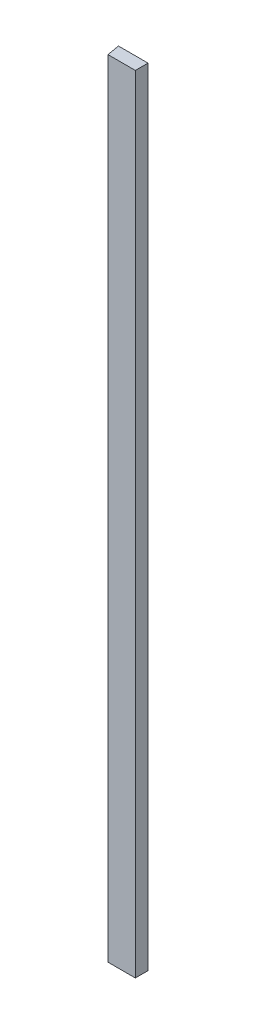
ISO-10303-21;
HEADER;
FILE_DESCRIPTION(('STEP AP214'),'2;1');
FILE_NAME('part.step','',(''),(''),'','','');
FILE_SCHEMA(('AUTOMOTIVE_DESIGN { 1 0 10303 214 1 1 1 1 }'));
ENDSEC;
DATA;
#1=APPLICATION_CONTEXT('core data for automotive mechanical design processes');
#2=APPLICATION_PROTOCOL_DEFINITION('international standard','automotive_design',2000,#1);
#3=PRODUCT_CONTEXT('',#1,'mechanical');
#4=PRODUCT('Part','Part','',(#3));
#5=PRODUCT_RELATED_PRODUCT_CATEGORY('part','',(#4));
#6=PRODUCT_DEFINITION_FORMATION('','',#4);
#7=PRODUCT_DEFINITION_CONTEXT('part definition',#1,'design');
#8=PRODUCT_DEFINITION('design','',#6,#7);
#9=PRODUCT_DEFINITION_SHAPE('','',#8);
#10=(LENGTH_UNIT() NAMED_UNIT(*) SI_UNIT(.MILLI.,.METRE.));
#11=(NAMED_UNIT(*) PLANE_ANGLE_UNIT() SI_UNIT($,.RADIAN.));
#12=(NAMED_UNIT(*) SI_UNIT($,.STERADIAN.) SOLID_ANGLE_UNIT());
#13=UNCERTAINTY_MEASURE_WITH_UNIT(LENGTH_MEASURE(1.E-05),#10,'distance_accuracy_value','');
#14=(GEOMETRIC_REPRESENTATION_CONTEXT(3) GLOBAL_UNCERTAINTY_ASSIGNED_CONTEXT((#13)) GLOBAL_UNIT_ASSIGNED_CONTEXT((#10,
#11,#12)) REPRESENTATION_CONTEXT('',''));
#15=CARTESIAN_POINT('',(0.,0.,0.));
#16=DIRECTION('',(0.,0.,1.));
#17=DIRECTION('',(1.,0.,0.));
#18=AXIS2_PLACEMENT_3D('',#15,#16,#17);
#19=CARTESIAN_POINT('',(44.45,2362.2,-19.05));
#20=DIRECTION('',(-1.,0.,0.));
#21=DIRECTION('',(0.,0.,1.));
#22=AXIS2_PLACEMENT_3D('',#19,#20,#21);
#23=PLANE('',#22);
#24=DIRECTION('',(0.,0.,-1.));
#25=VECTOR('',#24,1.);
#26=CARTESIAN_POINT('',(44.45,0.,-19.05));
#27=LINE('',#26,#25);
#28=CARTESIAN_POINT('',(44.45,0.,19.05));
#29=VERTEX_POINT('',#28);
#30=CARTESIAN_POINT('',(44.45,0.,-19.05));
#31=VERTEX_POINT('',#30);
#32=EDGE_CURVE('E96',#29,#31,#27,.T.);
#33=ORIENTED_EDGE('',*,*,#32,.T.);
#34=DIRECTION('',(0.,-1.,0.));
#35=VECTOR('',#34,1.);
#36=CARTESIAN_POINT('',(44.45,2362.2,-19.05));
#37=LINE('',#36,#35);
#38=CARTESIAN_POINT('',(44.45,2362.2,-19.05));
#39=VERTEX_POINT('',#38);
#40=EDGE_CURVE('E11',#39,#31,#37,.T.);
#41=ORIENTED_EDGE('',*,*,#40,.F.);
#42=DIRECTION('',(0.,0.,-1.));
#43=VECTOR('',#42,1.);
#44=CARTESIAN_POINT('',(44.45,2362.2,-19.05));
#45=LINE('',#44,#43);
#46=CARTESIAN_POINT('',(44.45,2362.2,19.05));
#47=VERTEX_POINT('',#46);
#48=EDGE_CURVE('E84',#47,#39,#45,.T.);
#49=ORIENTED_EDGE('',*,*,#48,.F.);
#50=DIRECTION('',(0.,-1.,0.));
#51=VECTOR('',#50,1.);
#52=CARTESIAN_POINT('',(44.45,2362.2,19.05));
#53=LINE('',#52,#51);
#54=EDGE_CURVE('E92',#47,#29,#53,.T.);
#55=ORIENTED_EDGE('',*,*,#54,.T.);
#56=EDGE_LOOP('',(#33,#41,#49,#55));
#57=FACE_BOUND('',#56,.T.);
#58=ADVANCED_FACE('F33',(#57),#23,.F.);
#59=CARTESIAN_POINT('',(44.45,2362.2,-19.05));
#60=DIRECTION('',(0.,0.,1.));
#61=DIRECTION('',(1.,0.,0.));
#62=AXIS2_PLACEMENT_3D('',#59,#60,#61);
#63=PLANE('',#62);
#64=DIRECTION('',(-1.,0.,0.));
#65=VECTOR('',#64,1.);
#66=CARTESIAN_POINT('',(44.45,0.,-19.05));
#67=LINE('',#66,#65);
#68=CARTESIAN_POINT('',(-44.45,0.,-19.05));
#69=VERTEX_POINT('',#68);
#70=EDGE_CURVE('E88',#31,#69,#67,.T.);
#71=ORIENTED_EDGE('',*,*,#70,.T.);
#72=DIRECTION('',(0.,-1.,0.));
#73=VECTOR('',#72,1.);
#74=CARTESIAN_POINT('',(-44.45,2362.2,-19.05));
#75=LINE('',#74,#73);
#76=CARTESIAN_POINT('',(-44.45,2362.2,-19.05));
#77=VERTEX_POINT('',#76);
#78=EDGE_CURVE('E41',#77,#69,#75,.T.);
#79=ORIENTED_EDGE('',*,*,#78,.F.);
#80=DIRECTION('',(-1.,0.,0.));
#81=VECTOR('',#80,1.);
#82=CARTESIAN_POINT('',(44.45,2362.2,-19.05));
#83=LINE('',#82,#81);
#84=EDGE_CURVE('E79',#39,#77,#83,.T.);
#85=ORIENTED_EDGE('',*,*,#84,.F.);
#86=ORIENTED_EDGE('',*,*,#40,.T.);
#87=EDGE_LOOP('',(#71,#79,#85,#86));
#88=FACE_BOUND('',#87,.T.);
#89=ADVANCED_FACE('F87',(#88),#63,.F.);
#90=CARTESIAN_POINT('',(-44.45,2362.2,-19.05));
#91=DIRECTION('',(0.984807753012207,0.,-0.173648177666935));
#92=DIRECTION('',(-0.173648177666935,0.,-0.984807753012207));
#93=AXIS2_PLACEMENT_3D('',#90,#91,#92);
#94=PLANE('',#93);
#95=DIRECTION('',(0.173648177666935,0.,0.984807753012207));
#96=VECTOR('',#95,1.);
#97=CARTESIAN_POINT('',(-44.45,0.,-19.05));
#98=LINE('',#97,#96);
#99=CARTESIAN_POINT('',(-37.7319420350073,0.,19.05));
#100=VERTEX_POINT('',#99);
#101=EDGE_CURVE('E66',#69,#100,#98,.T.);
#102=ORIENTED_EDGE('',*,*,#101,.T.);
#103=DIRECTION('',(0.,-1.,0.));
#104=VECTOR('',#103,1.);
#105=CARTESIAN_POINT('',(-37.7319420350073,2362.2,19.05));
#106=LINE('',#105,#104);
#107=CARTESIAN_POINT('',(-37.7319420350073,2362.2,19.05));
#108=VERTEX_POINT('',#107);
#109=EDGE_CURVE('E89',#108,#100,#106,.T.);
#110=ORIENTED_EDGE('',*,*,#109,.F.);
#111=DIRECTION('',(0.173648177666935,0.,0.984807753012207));
#112=VECTOR('',#111,1.);
#113=CARTESIAN_POINT('',(-44.45,2362.2,-19.05));
#114=LINE('',#113,#112);
#115=EDGE_CURVE('E82',#77,#108,#114,.T.);
#116=ORIENTED_EDGE('',*,*,#115,.F.);
#117=ORIENTED_EDGE('',*,*,#78,.T.);
#118=EDGE_LOOP('',(#102,#110,#116,#117));
#119=FACE_BOUND('',#118,.T.);
#120=ADVANCED_FACE('F90',(#119),#94,.F.);
#121=CARTESIAN_POINT('',(44.45,2362.2,19.05));
#122=DIRECTION('',(0.,0.,-1.));
#123=DIRECTION('',(-1.,0.,0.));
#124=AXIS2_PLACEMENT_3D('',#121,#122,#123);
#125=PLANE('',#124);
#126=DIRECTION('',(1.,0.,0.));
#127=VECTOR('',#126,1.);
#128=CARTESIAN_POINT('',(44.45,0.,19.05));
#129=LINE('',#128,#127);
#130=EDGE_CURVE('E72',#100,#29,#129,.T.);
#131=ORIENTED_EDGE('',*,*,#130,.T.);
#132=ORIENTED_EDGE('',*,*,#54,.F.);
#133=DIRECTION('',(1.,0.,0.));
#134=VECTOR('',#133,1.);
#135=CARTESIAN_POINT('',(44.45,2362.2,19.05));
#136=LINE('',#135,#134);
#137=EDGE_CURVE('E49',#108,#47,#136,.T.);
#138=ORIENTED_EDGE('',*,*,#137,.F.);
#139=ORIENTED_EDGE('',*,*,#109,.T.);
#140=EDGE_LOOP('',(#131,#132,#138,#139));
#141=FACE_BOUND('',#140,.T.);
#142=ADVANCED_FACE('F103',(#141),#125,.F.);
#143=CARTESIAN_POINT('',(0.,2362.2,0.));
#144=DIRECTION('',(0.,-1.,0.));
#145=DIRECTION('',(0.,0.,-1.));
#146=AXIS2_PLACEMENT_3D('',#143,#144,#145);
#147=PLANE('',#146);
#148=ORIENTED_EDGE('',*,*,#48,.T.);
#149=ORIENTED_EDGE('',*,*,#84,.T.);
#150=ORIENTED_EDGE('',*,*,#115,.T.);
#151=ORIENTED_EDGE('',*,*,#137,.T.);
#152=EDGE_LOOP('',(#148,#149,#150,#151));
#153=FACE_BOUND('',#152,.T.);
#154=ADVANCED_FACE('F80',(#153),#147,.F.);
#155=CARTESIAN_POINT('',(0.,0.,0.));
#156=DIRECTION('',(0.,-1.,0.));
#157=DIRECTION('',(0.,0.,-1.));
#158=AXIS2_PLACEMENT_3D('',#155,#156,#157);
#159=PLANE('',#158);
#160=ORIENTED_EDGE('',*,*,#32,.F.);
#161=ORIENTED_EDGE('',*,*,#130,.F.);
#162=ORIENTED_EDGE('',*,*,#101,.F.);
#163=ORIENTED_EDGE('',*,*,#70,.F.);
#164=EDGE_LOOP('',(#160,#161,#162,#163));
#165=FACE_BOUND('',#164,.T.);
#166=ADVANCED_FACE('F106',(#165),#159,.T.);
#167=CLOSED_SHELL('',(#58,#89,#120,#142,#154,#166));
#168=MANIFOLD_SOLID_BREP('B2',#167);
#169=ADVANCED_BREP_SHAPE_REPRESENTATION('',(#18,#168),#14);
#170=SHAPE_DEFINITION_REPRESENTATION(#9,#169);
ENDSEC;
END-ISO-10303-21;
